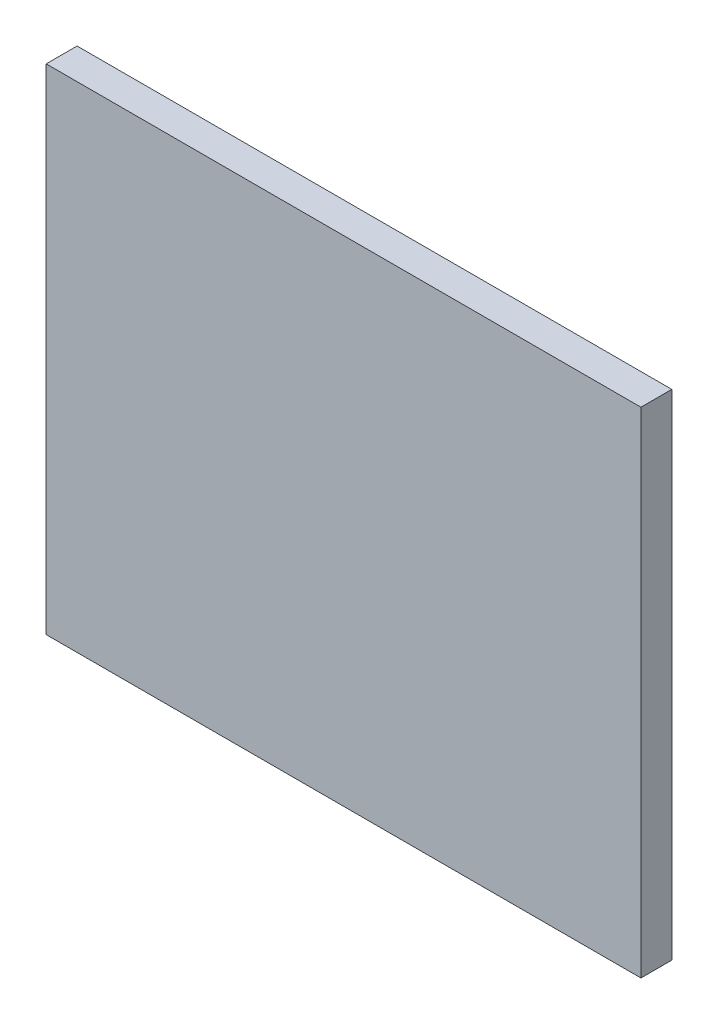
ISO-10303-21;
HEADER;
FILE_DESCRIPTION(('STEP AP214'),'2;1');
FILE_NAME('part.step','',(''),(''),'','','');
FILE_SCHEMA(('AUTOMOTIVE_DESIGN { 1 0 10303 214 1 1 1 1 }'));
ENDSEC;
DATA;
#1=APPLICATION_CONTEXT('core data for automotive mechanical design processes');
#2=APPLICATION_PROTOCOL_DEFINITION('international standard','automotive_design',2000,#1);
#3=PRODUCT_CONTEXT('',#1,'mechanical');
#4=PRODUCT('Part','Part','',(#3));
#5=PRODUCT_RELATED_PRODUCT_CATEGORY('part','',(#4));
#6=PRODUCT_DEFINITION_FORMATION('','',#4);
#7=PRODUCT_DEFINITION_CONTEXT('part definition',#1,'design');
#8=PRODUCT_DEFINITION('design','',#6,#7);
#9=PRODUCT_DEFINITION_SHAPE('','',#8);
#10=(LENGTH_UNIT() NAMED_UNIT(*) SI_UNIT(.MILLI.,.METRE.));
#11=(NAMED_UNIT(*) PLANE_ANGLE_UNIT() SI_UNIT($,.RADIAN.));
#12=(NAMED_UNIT(*) SI_UNIT($,.STERADIAN.) SOLID_ANGLE_UNIT());
#13=UNCERTAINTY_MEASURE_WITH_UNIT(LENGTH_MEASURE(1.E-05),#10,'distance_accuracy_value','');
#14=(GEOMETRIC_REPRESENTATION_CONTEXT(3) GLOBAL_UNCERTAINTY_ASSIGNED_CONTEXT((#13)) GLOBAL_UNIT_ASSIGNED_CONTEXT((#10,
#11,#12)) REPRESENTATION_CONTEXT('',''));
#15=CARTESIAN_POINT('',(0.,0.,0.));
#16=DIRECTION('',(0.,0.,1.));
#17=DIRECTION('',(1.,0.,0.));
#18=AXIS2_PLACEMENT_3D('',#15,#16,#17);
#19=CARTESIAN_POINT('',(38.5,-32.,4.));
#20=DIRECTION('',(-1.,0.,0.));
#21=DIRECTION('',(0.,0.,1.));
#22=AXIS2_PLACEMENT_3D('',#19,#20,#21);
#23=PLANE('',#22);
#24=DIRECTION('',(0.,1.,0.));
#25=VECTOR('',#24,1.);
#26=CARTESIAN_POINT('',(38.5,-32.,0.));
#27=LINE('',#26,#25);
#28=CARTESIAN_POINT('',(38.5,-32.,0.));
#29=VERTEX_POINT('',#28);
#30=CARTESIAN_POINT('',(38.5,32.,0.));
#31=VERTEX_POINT('',#30);
#32=EDGE_CURVE('E95',#29,#31,#27,.T.);
#33=ORIENTED_EDGE('',*,*,#32,.T.);
#34=DIRECTION('',(0.,0.,-1.));
#35=VECTOR('',#34,1.);
#36=CARTESIAN_POINT('',(38.5,32.,4.));
#37=LINE('',#36,#35);
#38=CARTESIAN_POINT('',(38.5,32.,4.));
#39=VERTEX_POINT('',#38);
#40=EDGE_CURVE('E11',#39,#31,#37,.T.);
#41=ORIENTED_EDGE('',*,*,#40,.F.);
#42=DIRECTION('',(0.,1.,0.));
#43=VECTOR('',#42,1.);
#44=CARTESIAN_POINT('',(38.5,-32.,4.));
#45=LINE('',#44,#43);
#46=CARTESIAN_POINT('',(38.5,-32.,4.));
#47=VERTEX_POINT('',#46);
#48=EDGE_CURVE('E83',#47,#39,#45,.T.);
#49=ORIENTED_EDGE('',*,*,#48,.F.);
#50=DIRECTION('',(0.,0.,-1.));
#51=VECTOR('',#50,1.);
#52=CARTESIAN_POINT('',(38.5,-32.,4.));
#53=LINE('',#52,#51);
#54=EDGE_CURVE('E91',#47,#29,#53,.T.);
#55=ORIENTED_EDGE('',*,*,#54,.T.);
#56=EDGE_LOOP('',(#33,#41,#49,#55));
#57=FACE_BOUND('',#56,.T.);
#58=ADVANCED_FACE('F32',(#57),#23,.F.);
#59=CARTESIAN_POINT('',(-38.5,32.,4.));
#60=DIRECTION('',(0.,-1.,0.));
#61=DIRECTION('',(0.,0.,-1.));
#62=AXIS2_PLACEMENT_3D('',#59,#60,#61);
#63=PLANE('',#62);
#64=DIRECTION('',(-1.,0.,0.));
#65=VECTOR('',#64,1.);
#66=CARTESIAN_POINT('',(-38.5,32.,0.));
#67=LINE('',#66,#65);
#68=CARTESIAN_POINT('',(-38.5,32.,0.));
#69=VERTEX_POINT('',#68);
#70=EDGE_CURVE('E87',#31,#69,#67,.T.);
#71=ORIENTED_EDGE('',*,*,#70,.T.);
#72=DIRECTION('',(0.,0.,-1.));
#73=VECTOR('',#72,1.);
#74=CARTESIAN_POINT('',(-38.5,32.,4.));
#75=LINE('',#74,#73);
#76=CARTESIAN_POINT('',(-38.5,32.,4.));
#77=VERTEX_POINT('',#76);
#78=EDGE_CURVE('E40',#77,#69,#75,.T.);
#79=ORIENTED_EDGE('',*,*,#78,.F.);
#80=DIRECTION('',(-1.,0.,0.));
#81=VECTOR('',#80,1.);
#82=CARTESIAN_POINT('',(-38.5,32.,4.));
#83=LINE('',#82,#81);
#84=EDGE_CURVE('E78',#39,#77,#83,.T.);
#85=ORIENTED_EDGE('',*,*,#84,.F.);
#86=ORIENTED_EDGE('',*,*,#40,.T.);
#87=EDGE_LOOP('',(#71,#79,#85,#86));
#88=FACE_BOUND('',#87,.T.);
#89=ADVANCED_FACE('F86',(#88),#63,.F.);
#90=CARTESIAN_POINT('',(-38.5,-32.,4.));
#91=DIRECTION('',(1.,0.,0.));
#92=DIRECTION('',(0.,0.,-1.));
#93=AXIS2_PLACEMENT_3D('',#90,#91,#92);
#94=PLANE('',#93);
#95=DIRECTION('',(0.,-1.,0.));
#96=VECTOR('',#95,1.);
#97=CARTESIAN_POINT('',(-38.5,-32.,0.));
#98=LINE('',#97,#96);
#99=CARTESIAN_POINT('',(-38.5,-32.,0.));
#100=VERTEX_POINT('',#99);
#101=EDGE_CURVE('E65',#69,#100,#98,.T.);
#102=ORIENTED_EDGE('',*,*,#101,.T.);
#103=DIRECTION('',(0.,0.,-1.));
#104=VECTOR('',#103,1.);
#105=CARTESIAN_POINT('',(-38.5,-32.,4.));
#106=LINE('',#105,#104);
#107=CARTESIAN_POINT('',(-38.5,-32.,4.));
#108=VERTEX_POINT('',#107);
#109=EDGE_CURVE('E88',#108,#100,#106,.T.);
#110=ORIENTED_EDGE('',*,*,#109,.F.);
#111=DIRECTION('',(0.,-1.,0.));
#112=VECTOR('',#111,1.);
#113=CARTESIAN_POINT('',(-38.5,-32.,4.));
#114=LINE('',#113,#112);
#115=EDGE_CURVE('E81',#77,#108,#114,.T.);
#116=ORIENTED_EDGE('',*,*,#115,.F.);
#117=ORIENTED_EDGE('',*,*,#78,.T.);
#118=EDGE_LOOP('',(#102,#110,#116,#117));
#119=FACE_BOUND('',#118,.T.);
#120=ADVANCED_FACE('F89',(#119),#94,.F.);
#121=CARTESIAN_POINT('',(-38.5,-32.,4.));
#122=DIRECTION('',(0.,1.,0.));
#123=DIRECTION('',(0.,0.,1.));
#124=AXIS2_PLACEMENT_3D('',#121,#122,#123);
#125=PLANE('',#124);
#126=DIRECTION('',(1.,0.,0.));
#127=VECTOR('',#126,1.);
#128=CARTESIAN_POINT('',(-38.5,-32.,0.));
#129=LINE('',#128,#127);
#130=EDGE_CURVE('E71',#100,#29,#129,.T.);
#131=ORIENTED_EDGE('',*,*,#130,.T.);
#132=ORIENTED_EDGE('',*,*,#54,.F.);
#133=DIRECTION('',(1.,0.,0.));
#134=VECTOR('',#133,1.);
#135=CARTESIAN_POINT('',(-38.5,-32.,4.));
#136=LINE('',#135,#134);
#137=EDGE_CURVE('E48',#108,#47,#136,.T.);
#138=ORIENTED_EDGE('',*,*,#137,.F.);
#139=ORIENTED_EDGE('',*,*,#109,.T.);
#140=EDGE_LOOP('',(#131,#132,#138,#139));
#141=FACE_BOUND('',#140,.T.);
#142=ADVANCED_FACE('F102',(#141),#125,.F.);
#143=CARTESIAN_POINT('',(0.,0.,4.));
#144=DIRECTION('',(0.,0.,-1.));
#145=DIRECTION('',(-1.,0.,0.));
#146=AXIS2_PLACEMENT_3D('',#143,#144,#145);
#147=PLANE('',#146);
#148=ORIENTED_EDGE('',*,*,#48,.T.);
#149=ORIENTED_EDGE('',*,*,#84,.T.);
#150=ORIENTED_EDGE('',*,*,#115,.T.);
#151=ORIENTED_EDGE('',*,*,#137,.T.);
#152=EDGE_LOOP('',(#148,#149,#150,#151));
#153=FACE_BOUND('',#152,.T.);
#154=ADVANCED_FACE('F79',(#153),#147,.F.);
#155=CARTESIAN_POINT('',(0.,0.,0.));
#156=DIRECTION('',(0.,0.,-1.));
#157=DIRECTION('',(-1.,0.,0.));
#158=AXIS2_PLACEMENT_3D('',#155,#156,#157);
#159=PLANE('',#158);
#160=ORIENTED_EDGE('',*,*,#32,.F.);
#161=ORIENTED_EDGE('',*,*,#130,.F.);
#162=ORIENTED_EDGE('',*,*,#101,.F.);
#163=ORIENTED_EDGE('',*,*,#70,.F.);
#164=EDGE_LOOP('',(#160,#161,#162,#163));
#165=FACE_BOUND('',#164,.T.);
#166=ADVANCED_FACE('F105',(#165),#159,.T.);
#167=CLOSED_SHELL('',(#58,#89,#120,#142,#154,#166));
#168=MANIFOLD_SOLID_BREP('B2',#167);
#169=ADVANCED_BREP_SHAPE_REPRESENTATION('',(#18,#168),#14);
#170=SHAPE_DEFINITION_REPRESENTATION(#9,#169);
ENDSEC;
END-ISO-10303-21;
